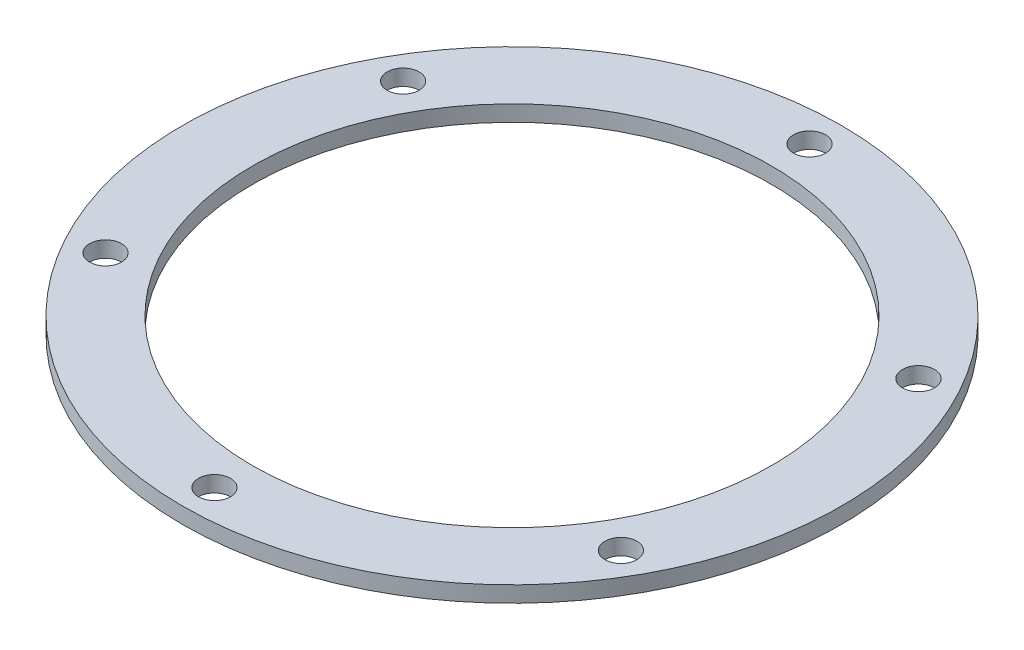
ISO-10303-21;
HEADER;
FILE_DESCRIPTION(('STEP AP214'),'2;1');
FILE_NAME('part.step','',(''),(''),'','','');
FILE_SCHEMA(('AUTOMOTIVE_DESIGN { 1 0 10303 214 1 1 1 1 }'));
ENDSEC;
DATA;
#1=APPLICATION_CONTEXT('core data for automotive mechanical design processes');
#2=APPLICATION_PROTOCOL_DEFINITION('international standard','automotive_design',2000,#1);
#3=PRODUCT_CONTEXT('',#1,'mechanical');
#4=PRODUCT('Part','Part','',(#3));
#5=PRODUCT_RELATED_PRODUCT_CATEGORY('part','',(#4));
#6=PRODUCT_DEFINITION_FORMATION('','',#4);
#7=PRODUCT_DEFINITION_CONTEXT('part definition',#1,'design');
#8=PRODUCT_DEFINITION('design','',#6,#7);
#9=PRODUCT_DEFINITION_SHAPE('','',#8);
#10=(LENGTH_UNIT() NAMED_UNIT(*) SI_UNIT(.MILLI.,.METRE.));
#11=(NAMED_UNIT(*) PLANE_ANGLE_UNIT() SI_UNIT($,.RADIAN.));
#12=(NAMED_UNIT(*) SI_UNIT($,.STERADIAN.) SOLID_ANGLE_UNIT());
#13=UNCERTAINTY_MEASURE_WITH_UNIT(LENGTH_MEASURE(1.E-05),#10,'distance_accuracy_value','');
#14=(GEOMETRIC_REPRESENTATION_CONTEXT(3) GLOBAL_UNCERTAINTY_ASSIGNED_CONTEXT((#13)) GLOBAL_UNIT_ASSIGNED_CONTEXT((#10,
#11,#12)) REPRESENTATION_CONTEXT('',''));
#15=CARTESIAN_POINT('',(0.,0.,0.));
#16=DIRECTION('',(0.,0.,1.));
#17=DIRECTION('',(1.,0.,0.));
#18=AXIS2_PLACEMENT_3D('',#15,#16,#17);
#19=CARTESIAN_POINT('',(0.,2.,0.));
#20=DIRECTION('',(0.,1.,0.));
#21=DIRECTION('',(0.,0.,1.));
#22=AXIS2_PLACEMENT_3D('',#19,#20,#21);
#23=PLANE('',#22);
#24=CARTESIAN_POINT('',(0.,2.,37.195));
#25=DIRECTION('',(0.,1.,0.));
#26=DIRECTION('',(0.,0.,1.));
#27=AXIS2_PLACEMENT_3D('',#24,#25,#26);
#28=CIRCLE('',#27,2.);
#29=CARTESIAN_POINT('',(0.,2.,39.195));
#30=VERTEX_POINT('',#29);
#31=EDGE_CURVE('E94',#30,#30,#28,.T.);
#32=ORIENTED_EDGE('',*,*,#31,.F.);
#33=EDGE_LOOP('',(#32));
#34=FACE_BOUND('',#33,.T.);
#35=CARTESIAN_POINT('',(32.2118148937622,2.,-18.5975));
#36=DIRECTION('',(0.,1.,0.));
#37=DIRECTION('',(0.,0.,1.));
#38=AXIS2_PLACEMENT_3D('',#35,#36,#37);
#39=CIRCLE('',#38,2.00000000000001);
#40=CARTESIAN_POINT('',(32.2118148937622,2.,-16.5975));
#41=VERTEX_POINT('',#40);
#42=EDGE_CURVE('E78',#41,#41,#39,.T.);
#43=ORIENTED_EDGE('',*,*,#42,.F.);
#44=EDGE_LOOP('',(#43));
#45=FACE_BOUND('',#44,.T.);
#46=CARTESIAN_POINT('',(0.,2.,-37.195));
#47=DIRECTION('',(0.,1.,0.));
#48=DIRECTION('',(0.,0.,1.));
#49=AXIS2_PLACEMENT_3D('',#46,#47,#48);
#50=CIRCLE('',#49,2.);
#51=CARTESIAN_POINT('',(0.,2.,-35.195));
#52=VERTEX_POINT('',#51);
#53=EDGE_CURVE('E62',#52,#52,#50,.T.);
#54=ORIENTED_EDGE('',*,*,#53,.F.);
#55=EDGE_LOOP('',(#54));
#56=FACE_BOUND('',#55,.T.);
#57=CARTESIAN_POINT('',(0.,2.,0.));
#58=DIRECTION('',(0.,1.,0.));
#59=DIRECTION('',(0.,0.,1.));
#60=AXIS2_PLACEMENT_3D('',#57,#58,#59);
#61=CIRCLE('',#60,41.195);
#62=CARTESIAN_POINT('',(0.,2.,41.195));
#63=VERTEX_POINT('',#62);
#64=EDGE_CURVE('E10',#63,#63,#61,.T.);
#65=ORIENTED_EDGE('',*,*,#64,.T.);
#66=EDGE_LOOP('',(#65));
#67=FACE_BOUND('',#66,.T.);
#68=CARTESIAN_POINT('',(0.,2.,0.));
#69=DIRECTION('',(0.,1.,0.));
#70=DIRECTION('',(0.,0.,1.));
#71=AXIS2_PLACEMENT_3D('',#68,#69,#70);
#72=CIRCLE('',#71,32.445);
#73=CARTESIAN_POINT('',(0.,2.,32.445));
#74=VERTEX_POINT('',#73);
#75=EDGE_CURVE('E56',#74,#74,#72,.T.);
#76=ORIENTED_EDGE('',*,*,#75,.F.);
#77=EDGE_LOOP('',(#76));
#78=FACE_BOUND('',#77,.T.);
#79=CARTESIAN_POINT('',(-32.2118148937622,2.,18.5975));
#80=DIRECTION('',(0.,1.,0.));
#81=DIRECTION('',(0.,0.,1.));
#82=AXIS2_PLACEMENT_3D('',#79,#80,#81);
#83=CIRCLE('',#82,2.);
#84=CARTESIAN_POINT('',(-32.2118148937622,2.,20.5975));
#85=VERTEX_POINT('',#84);
#86=EDGE_CURVE('E70',#85,#85,#83,.T.);
#87=ORIENTED_EDGE('',*,*,#86,.F.);
#88=EDGE_LOOP('',(#87));
#89=FACE_BOUND('',#88,.T.);
#90=CARTESIAN_POINT('',(32.2118148937622,2.,18.5975));
#91=DIRECTION('',(0.,1.,0.));
#92=DIRECTION('',(0.,0.,1.));
#93=AXIS2_PLACEMENT_3D('',#90,#91,#92);
#94=CIRCLE('',#93,2.00000000000012);
#95=CARTESIAN_POINT('',(32.2118148937622,2.,20.5975000000001));
#96=VERTEX_POINT('',#95);
#97=EDGE_CURVE('E86',#96,#96,#94,.T.);
#98=ORIENTED_EDGE('',*,*,#97,.F.);
#99=EDGE_LOOP('',(#98));
#100=FACE_BOUND('',#99,.T.);
#101=CARTESIAN_POINT('',(-32.2118148937622,2.,-18.5975));
#102=DIRECTION('',(0.,1.,0.));
#103=DIRECTION('',(0.,0.,1.));
#104=AXIS2_PLACEMENT_3D('',#101,#102,#103);
#105=CIRCLE('',#104,2.);
#106=CARTESIAN_POINT('',(-32.2118148937622,2.,-16.5975));
#107=VERTEX_POINT('',#106);
#108=EDGE_CURVE('E102',#107,#107,#105,.T.);
#109=ORIENTED_EDGE('',*,*,#108,.F.);
#110=EDGE_LOOP('',(#109));
#111=FACE_BOUND('',#110,.T.);
#112=ADVANCED_FACE('F43',(#34,#45,#56,#67,#78,#89,#100,#111),#23,.T.);
#113=CARTESIAN_POINT('',(0.,0.,0.));
#114=DIRECTION('',(0.,1.,0.));
#115=DIRECTION('',(0.,0.,1.));
#116=AXIS2_PLACEMENT_3D('',#113,#114,#115);
#117=PLANE('',#116);
#118=CARTESIAN_POINT('',(0.,0.,0.));
#119=DIRECTION('',(0.,1.,0.));
#120=DIRECTION('',(0.,0.,1.));
#121=AXIS2_PLACEMENT_3D('',#118,#119,#120);
#122=CIRCLE('',#121,41.195);
#123=CARTESIAN_POINT('',(0.,0.,41.195));
#124=VERTEX_POINT('',#123);
#125=EDGE_CURVE('E47',#124,#124,#122,.T.);
#126=ORIENTED_EDGE('',*,*,#125,.F.);
#127=EDGE_LOOP('',(#126));
#128=FACE_BOUND('',#127,.T.);
#129=CARTESIAN_POINT('',(0.,0.,0.));
#130=DIRECTION('',(0.,1.,0.));
#131=DIRECTION('',(0.,0.,1.));
#132=AXIS2_PLACEMENT_3D('',#129,#130,#131);
#133=CIRCLE('',#132,32.445);
#134=CARTESIAN_POINT('',(0.,0.,32.445));
#135=VERTEX_POINT('',#134);
#136=EDGE_CURVE('E58',#135,#135,#133,.T.);
#137=ORIENTED_EDGE('',*,*,#136,.T.);
#138=EDGE_LOOP('',(#137));
#139=FACE_BOUND('',#138,.T.);
#140=CARTESIAN_POINT('',(0.,0.,-37.195));
#141=DIRECTION('',(0.,1.,0.));
#142=DIRECTION('',(0.,0.,1.));
#143=AXIS2_PLACEMENT_3D('',#140,#141,#142);
#144=CIRCLE('',#143,2.);
#145=CARTESIAN_POINT('',(0.,0.,-35.195));
#146=VERTEX_POINT('',#145);
#147=EDGE_CURVE('E66',#146,#146,#144,.T.);
#148=ORIENTED_EDGE('',*,*,#147,.T.);
#149=EDGE_LOOP('',(#148));
#150=FACE_BOUND('',#149,.T.);
#151=CARTESIAN_POINT('',(-32.2118148937622,0.,18.5975));
#152=DIRECTION('',(0.,1.,0.));
#153=DIRECTION('',(0.,0.,1.));
#154=AXIS2_PLACEMENT_3D('',#151,#152,#153);
#155=CIRCLE('',#154,2.);
#156=CARTESIAN_POINT('',(-32.2118148937622,0.,20.5975));
#157=VERTEX_POINT('',#156);
#158=EDGE_CURVE('E74',#157,#157,#155,.T.);
#159=ORIENTED_EDGE('',*,*,#158,.T.);
#160=EDGE_LOOP('',(#159));
#161=FACE_BOUND('',#160,.T.);
#162=CARTESIAN_POINT('',(32.2118148937622,0.,-18.5975));
#163=DIRECTION('',(0.,1.,0.));
#164=DIRECTION('',(0.,0.,1.));
#165=AXIS2_PLACEMENT_3D('',#162,#163,#164);
#166=CIRCLE('',#165,2.00000000000001);
#167=CARTESIAN_POINT('',(32.2118148937622,0.,-16.5975));
#168=VERTEX_POINT('',#167);
#169=EDGE_CURVE('E82',#168,#168,#166,.T.);
#170=ORIENTED_EDGE('',*,*,#169,.T.);
#171=EDGE_LOOP('',(#170));
#172=FACE_BOUND('',#171,.T.);
#173=CARTESIAN_POINT('',(32.2118148937622,0.,18.5975));
#174=DIRECTION('',(0.,1.,0.));
#175=DIRECTION('',(0.,0.,1.));
#176=AXIS2_PLACEMENT_3D('',#173,#174,#175);
#177=CIRCLE('',#176,2.00000000000012);
#178=CARTESIAN_POINT('',(32.2118148937622,0.,20.5975000000001));
#179=VERTEX_POINT('',#178);
#180=EDGE_CURVE('E90',#179,#179,#177,.T.);
#181=ORIENTED_EDGE('',*,*,#180,.T.);
#182=EDGE_LOOP('',(#181));
#183=FACE_BOUND('',#182,.T.);
#184=CARTESIAN_POINT('',(0.,0.,37.195));
#185=DIRECTION('',(0.,1.,0.));
#186=DIRECTION('',(0.,0.,1.));
#187=AXIS2_PLACEMENT_3D('',#184,#185,#186);
#188=CIRCLE('',#187,2.);
#189=CARTESIAN_POINT('',(0.,0.,39.195));
#190=VERTEX_POINT('',#189);
#191=EDGE_CURVE('E98',#190,#190,#188,.T.);
#192=ORIENTED_EDGE('',*,*,#191,.T.);
#193=EDGE_LOOP('',(#192));
#194=FACE_BOUND('',#193,.T.);
#195=CARTESIAN_POINT('',(-32.2118148937622,0.,-18.5975));
#196=DIRECTION('',(0.,1.,0.));
#197=DIRECTION('',(0.,0.,1.));
#198=AXIS2_PLACEMENT_3D('',#195,#196,#197);
#199=CIRCLE('',#198,2.);
#200=CARTESIAN_POINT('',(-32.2118148937622,0.,-16.5975));
#201=VERTEX_POINT('',#200);
#202=EDGE_CURVE('E106',#201,#201,#199,.T.);
#203=ORIENTED_EDGE('',*,*,#202,.T.);
#204=EDGE_LOOP('',(#203));
#205=FACE_BOUND('',#204,.T.);
#206=ADVANCED_FACE('F118',(#128,#139,#150,#161,#172,#183,#194,#205),#117,.F.);
#207=CARTESIAN_POINT('',(0.,2.,0.));
#208=DIRECTION('',(0.,-1.,0.));
#209=DIRECTION('',(0.,0.,-1.));
#210=AXIS2_PLACEMENT_3D('',#207,#208,#209);
#211=CYLINDRICAL_SURFACE('',#210,41.195);
#212=ORIENTED_EDGE('',*,*,#64,.F.);
#213=EDGE_LOOP('',(#212));
#214=FACE_BOUND('',#213,.T.);
#215=ORIENTED_EDGE('',*,*,#125,.T.);
#216=EDGE_LOOP('',(#215));
#217=FACE_BOUND('',#216,.T.);
#218=ADVANCED_FACE('F45',(#214,#217),#211,.T.);
#219=CARTESIAN_POINT('',(0.,2.,0.));
#220=DIRECTION('',(0.,-1.,0.));
#221=DIRECTION('',(0.,0.,-1.));
#222=AXIS2_PLACEMENT_3D('',#219,#220,#221);
#223=CYLINDRICAL_SURFACE('',#222,32.445);
#224=ORIENTED_EDGE('',*,*,#75,.T.);
#225=EDGE_LOOP('',(#224));
#226=FACE_BOUND('',#225,.T.);
#227=ORIENTED_EDGE('',*,*,#136,.F.);
#228=EDGE_LOOP('',(#227));
#229=FACE_BOUND('',#228,.T.);
#230=ADVANCED_FACE('F128',(#226,#229),#223,.F.);
#231=CARTESIAN_POINT('',(0.,2.,-37.195));
#232=DIRECTION('',(0.,-1.,0.));
#233=DIRECTION('',(0.,0.,-1.));
#234=AXIS2_PLACEMENT_3D('',#231,#232,#233);
#235=CYLINDRICAL_SURFACE('',#234,2.);
#236=ORIENTED_EDGE('',*,*,#53,.T.);
#237=EDGE_LOOP('',(#236));
#238=FACE_BOUND('',#237,.T.);
#239=ORIENTED_EDGE('',*,*,#147,.F.);
#240=EDGE_LOOP('',(#239));
#241=FACE_BOUND('',#240,.T.);
#242=ADVANCED_FACE('F131',(#238,#241),#235,.F.);
#243=CARTESIAN_POINT('',(-32.2118148937622,2.,18.5975));
#244=DIRECTION('',(0.,-1.,0.));
#245=DIRECTION('',(0.,0.,-1.));
#246=AXIS2_PLACEMENT_3D('',#243,#244,#245);
#247=CYLINDRICAL_SURFACE('',#246,2.);
#248=ORIENTED_EDGE('',*,*,#86,.T.);
#249=EDGE_LOOP('',(#248));
#250=FACE_BOUND('',#249,.T.);
#251=ORIENTED_EDGE('',*,*,#158,.F.);
#252=EDGE_LOOP('',(#251));
#253=FACE_BOUND('',#252,.T.);
#254=ADVANCED_FACE('F135',(#250,#253),#247,.F.);
#255=CARTESIAN_POINT('',(32.2118148937622,2.,-18.5975));
#256=DIRECTION('',(0.,-1.,0.));
#257=DIRECTION('',(0.,0.,-1.));
#258=AXIS2_PLACEMENT_3D('',#255,#256,#257);
#259=CYLINDRICAL_SURFACE('',#258,2.00000000000001);
#260=ORIENTED_EDGE('',*,*,#42,.T.);
#261=EDGE_LOOP('',(#260));
#262=FACE_BOUND('',#261,.T.);
#263=ORIENTED_EDGE('',*,*,#169,.F.);
#264=EDGE_LOOP('',(#263));
#265=FACE_BOUND('',#264,.T.);
#266=ADVANCED_FACE('F139',(#262,#265),#259,.F.);
#267=CARTESIAN_POINT('',(32.2118148937622,2.,18.5975));
#268=DIRECTION('',(0.,-1.,0.));
#269=DIRECTION('',(0.,0.,-1.));
#270=AXIS2_PLACEMENT_3D('',#267,#268,#269);
#271=CYLINDRICAL_SURFACE('',#270,2.00000000000012);
#272=ORIENTED_EDGE('',*,*,#97,.T.);
#273=EDGE_LOOP('',(#272));
#274=FACE_BOUND('',#273,.T.);
#275=ORIENTED_EDGE('',*,*,#180,.F.);
#276=EDGE_LOOP('',(#275));
#277=FACE_BOUND('',#276,.T.);
#278=ADVANCED_FACE('F143',(#274,#277),#271,.F.);
#279=CARTESIAN_POINT('',(0.,2.,37.195));
#280=DIRECTION('',(0.,-1.,0.));
#281=DIRECTION('',(0.,0.,-1.));
#282=AXIS2_PLACEMENT_3D('',#279,#280,#281);
#283=CYLINDRICAL_SURFACE('',#282,2.);
#284=ORIENTED_EDGE('',*,*,#31,.T.);
#285=EDGE_LOOP('',(#284));
#286=FACE_BOUND('',#285,.T.);
#287=ORIENTED_EDGE('',*,*,#191,.F.);
#288=EDGE_LOOP('',(#287));
#289=FACE_BOUND('',#288,.T.);
#290=ADVANCED_FACE('F147',(#286,#289),#283,.F.);
#291=CARTESIAN_POINT('',(-32.2118148937622,2.,-18.5975));
#292=DIRECTION('',(0.,-1.,0.));
#293=DIRECTION('',(0.,0.,-1.));
#294=AXIS2_PLACEMENT_3D('',#291,#292,#293);
#295=CYLINDRICAL_SURFACE('',#294,2.);
#296=ORIENTED_EDGE('',*,*,#108,.T.);
#297=EDGE_LOOP('',(#296));
#298=FACE_BOUND('',#297,.T.);
#299=ORIENTED_EDGE('',*,*,#202,.F.);
#300=EDGE_LOOP('',(#299));
#301=FACE_BOUND('',#300,.T.);
#302=ADVANCED_FACE('F114',(#298,#301),#295,.F.);
#303=CLOSED_SHELL('',(#112,#206,#218,#230,#242,#254,#266,#278,#290,#302));
#304=MANIFOLD_SOLID_BREP('B2',#303);
#305=ADVANCED_BREP_SHAPE_REPRESENTATION('',(#18,#304),#14);
#306=SHAPE_DEFINITION_REPRESENTATION(#9,#305);
ENDSEC;
END-ISO-10303-21;
